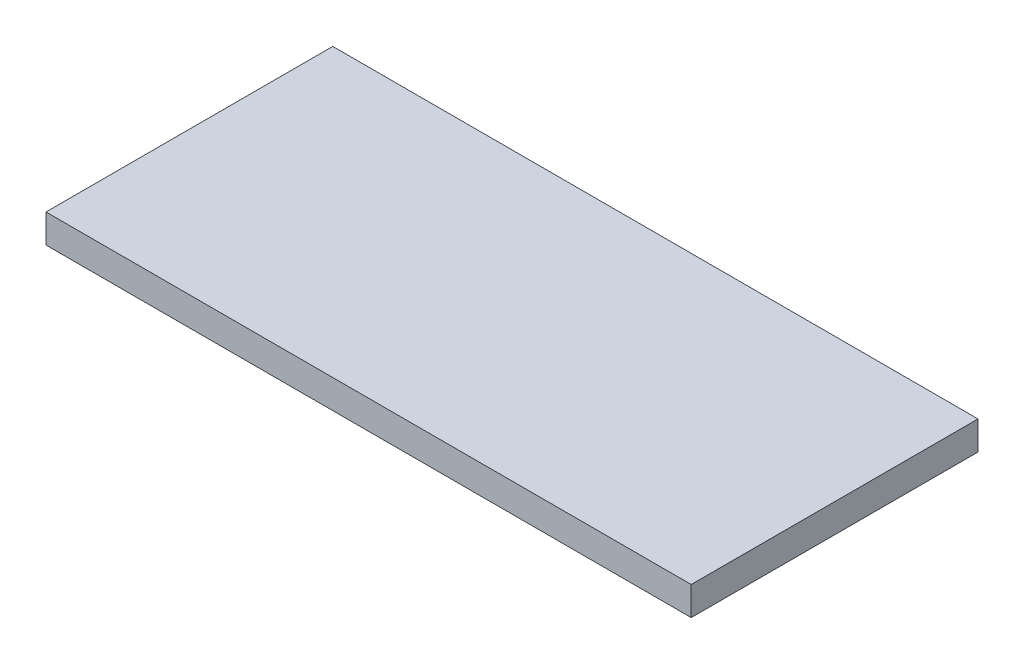
ISO-10303-21;
HEADER;
FILE_DESCRIPTION(('STEP AP214'),'2;1');
FILE_NAME('part.step','',(''),(''),'','','');
FILE_SCHEMA(('AUTOMOTIVE_DESIGN { 1 0 10303 214 1 1 1 1 }'));
ENDSEC;
DATA;
#1=APPLICATION_CONTEXT('core data for automotive mechanical design processes');
#2=APPLICATION_PROTOCOL_DEFINITION('international standard','automotive_design',2000,#1);
#3=PRODUCT_CONTEXT('',#1,'mechanical');
#4=PRODUCT('Part','Part','',(#3));
#5=PRODUCT_RELATED_PRODUCT_CATEGORY('part','',(#4));
#6=PRODUCT_DEFINITION_FORMATION('','',#4);
#7=PRODUCT_DEFINITION_CONTEXT('part definition',#1,'design');
#8=PRODUCT_DEFINITION('design','',#6,#7);
#9=PRODUCT_DEFINITION_SHAPE('','',#8);
#10=(LENGTH_UNIT() NAMED_UNIT(*) SI_UNIT(.MILLI.,.METRE.));
#11=(NAMED_UNIT(*) PLANE_ANGLE_UNIT() SI_UNIT($,.RADIAN.));
#12=(NAMED_UNIT(*) SI_UNIT($,.STERADIAN.) SOLID_ANGLE_UNIT());
#13=UNCERTAINTY_MEASURE_WITH_UNIT(LENGTH_MEASURE(1.E-05),#10,'distance_accuracy_value','');
#14=(GEOMETRIC_REPRESENTATION_CONTEXT(3) GLOBAL_UNCERTAINTY_ASSIGNED_CONTEXT((#13)) GLOBAL_UNIT_ASSIGNED_CONTEXT((#10,
#11,#12)) REPRESENTATION_CONTEXT('',''));
#15=CARTESIAN_POINT('',(0.,0.,0.));
#16=DIRECTION('',(0.,0.,1.));
#17=DIRECTION('',(1.,0.,0.));
#18=AXIS2_PLACEMENT_3D('',#15,#16,#17);
#19=CARTESIAN_POINT('',(-90.,8.,-40.));
#20=DIRECTION('',(1.,0.,0.));
#21=DIRECTION('',(0.,0.,-1.));
#22=AXIS2_PLACEMENT_3D('',#19,#20,#21);
#23=PLANE('',#22);
#24=DIRECTION('',(0.,0.,1.));
#25=VECTOR('',#24,1.);
#26=CARTESIAN_POINT('',(-90.,0.,-40.));
#27=LINE('',#26,#25);
#28=CARTESIAN_POINT('',(-90.,0.,-40.));
#29=VERTEX_POINT('',#28);
#30=CARTESIAN_POINT('',(-90.,0.,40.));
#31=VERTEX_POINT('',#30);
#32=EDGE_CURVE('E100',#29,#31,#27,.T.);
#33=ORIENTED_EDGE('',*,*,#32,.T.);
#34=DIRECTION('',(0.,-1.,0.));
#35=VECTOR('',#34,1.);
#36=CARTESIAN_POINT('',(-90.,8.,40.));
#37=LINE('',#36,#35);
#38=CARTESIAN_POINT('',(-90.,8.,40.));
#39=VERTEX_POINT('',#38);
#40=EDGE_CURVE('E11',#39,#31,#37,.T.);
#41=ORIENTED_EDGE('',*,*,#40,.F.);
#42=DIRECTION('',(0.,0.,1.));
#43=VECTOR('',#42,1.);
#44=CARTESIAN_POINT('',(-90.,8.,-40.));
#45=LINE('',#44,#43);
#46=CARTESIAN_POINT('',(-90.,8.,-40.));
#47=VERTEX_POINT('',#46);
#48=EDGE_CURVE('E88',#47,#39,#45,.T.);
#49=ORIENTED_EDGE('',*,*,#48,.F.);
#50=DIRECTION('',(0.,-1.,0.));
#51=VECTOR('',#50,1.);
#52=CARTESIAN_POINT('',(-90.,8.,-40.));
#53=LINE('',#52,#51);
#54=EDGE_CURVE('E96',#47,#29,#53,.T.);
#55=ORIENTED_EDGE('',*,*,#54,.T.);
#56=EDGE_LOOP('',(#33,#41,#49,#55));
#57=FACE_BOUND('',#56,.T.);
#58=ADVANCED_FACE('F37',(#57),#23,.F.);
#59=CARTESIAN_POINT('',(-90.,8.,40.));
#60=DIRECTION('',(0.,0.,-1.));
#61=DIRECTION('',(-1.,0.,0.));
#62=AXIS2_PLACEMENT_3D('',#59,#60,#61);
#63=PLANE('',#62);
#64=DIRECTION('',(1.,0.,0.));
#65=VECTOR('',#64,1.);
#66=CARTESIAN_POINT('',(-90.,0.,40.));
#67=LINE('',#66,#65);
#68=CARTESIAN_POINT('',(90.,0.,40.));
#69=VERTEX_POINT('',#68);
#70=EDGE_CURVE('E92',#31,#69,#67,.T.);
#71=ORIENTED_EDGE('',*,*,#70,.T.);
#72=DIRECTION('',(0.,-1.,0.));
#73=VECTOR('',#72,1.);
#74=CARTESIAN_POINT('',(90.,8.,40.));
#75=LINE('',#74,#73);
#76=CARTESIAN_POINT('',(90.,8.,40.));
#77=VERTEX_POINT('',#76);
#78=EDGE_CURVE('E45',#77,#69,#75,.T.);
#79=ORIENTED_EDGE('',*,*,#78,.F.);
#80=DIRECTION('',(1.,0.,0.));
#81=VECTOR('',#80,1.);
#82=CARTESIAN_POINT('',(-90.,8.,40.));
#83=LINE('',#82,#81);
#84=EDGE_CURVE('E83',#39,#77,#83,.T.);
#85=ORIENTED_EDGE('',*,*,#84,.F.);
#86=ORIENTED_EDGE('',*,*,#40,.T.);
#87=EDGE_LOOP('',(#71,#79,#85,#86));
#88=FACE_BOUND('',#87,.T.);
#89=ADVANCED_FACE('F91',(#88),#63,.F.);
#90=CARTESIAN_POINT('',(90.,8.,-40.));
#91=DIRECTION('',(-1.,0.,0.));
#92=DIRECTION('',(0.,0.,1.));
#93=AXIS2_PLACEMENT_3D('',#90,#91,#92);
#94=PLANE('',#93);
#95=DIRECTION('',(0.,0.,-1.));
#96=VECTOR('',#95,1.);
#97=CARTESIAN_POINT('',(90.,0.,-40.));
#98=LINE('',#97,#96);
#99=CARTESIAN_POINT('',(90.,0.,-40.));
#100=VERTEX_POINT('',#99);
#101=EDGE_CURVE('E70',#69,#100,#98,.T.);
#102=ORIENTED_EDGE('',*,*,#101,.T.);
#103=DIRECTION('',(0.,-1.,0.));
#104=VECTOR('',#103,1.);
#105=CARTESIAN_POINT('',(90.,8.,-40.));
#106=LINE('',#105,#104);
#107=CARTESIAN_POINT('',(90.,8.,-40.));
#108=VERTEX_POINT('',#107);
#109=EDGE_CURVE('E93',#108,#100,#106,.T.);
#110=ORIENTED_EDGE('',*,*,#109,.F.);
#111=DIRECTION('',(0.,0.,-1.));
#112=VECTOR('',#111,1.);
#113=CARTESIAN_POINT('',(90.,8.,-40.));
#114=LINE('',#113,#112);
#115=EDGE_CURVE('E86',#77,#108,#114,.T.);
#116=ORIENTED_EDGE('',*,*,#115,.F.);
#117=ORIENTED_EDGE('',*,*,#78,.T.);
#118=EDGE_LOOP('',(#102,#110,#116,#117));
#119=FACE_BOUND('',#118,.T.);
#120=ADVANCED_FACE('F94',(#119),#94,.F.);
#121=CARTESIAN_POINT('',(-90.,8.,-40.));
#122=DIRECTION('',(0.,0.,1.));
#123=DIRECTION('',(1.,0.,0.));
#124=AXIS2_PLACEMENT_3D('',#121,#122,#123);
#125=PLANE('',#124);
#126=DIRECTION('',(-1.,0.,0.));
#127=VECTOR('',#126,1.);
#128=CARTESIAN_POINT('',(-90.,0.,-40.));
#129=LINE('',#128,#127);
#130=EDGE_CURVE('E76',#100,#29,#129,.T.);
#131=ORIENTED_EDGE('',*,*,#130,.T.);
#132=ORIENTED_EDGE('',*,*,#54,.F.);
#133=DIRECTION('',(-1.,0.,0.));
#134=VECTOR('',#133,1.);
#135=CARTESIAN_POINT('',(-90.,8.,-40.));
#136=LINE('',#135,#134);
#137=EDGE_CURVE('E53',#108,#47,#136,.T.);
#138=ORIENTED_EDGE('',*,*,#137,.F.);
#139=ORIENTED_EDGE('',*,*,#109,.T.);
#140=EDGE_LOOP('',(#131,#132,#138,#139));
#141=FACE_BOUND('',#140,.T.);
#142=ADVANCED_FACE('F107',(#141),#125,.F.);
#143=CARTESIAN_POINT('',(0.,8.,0.));
#144=DIRECTION('',(0.,1.,0.));
#145=DIRECTION('',(0.,0.,1.));
#146=AXIS2_PLACEMENT_3D('',#143,#144,#145);
#147=PLANE('',#146);
#148=ORIENTED_EDGE('',*,*,#48,.T.);
#149=ORIENTED_EDGE('',*,*,#84,.T.);
#150=ORIENTED_EDGE('',*,*,#115,.T.);
#151=ORIENTED_EDGE('',*,*,#137,.T.);
#152=EDGE_LOOP('',(#148,#149,#150,#151));
#153=FACE_BOUND('',#152,.T.);
#154=ADVANCED_FACE('F84',(#153),#147,.T.);
#155=CARTESIAN_POINT('',(0.,0.,0.));
#156=DIRECTION('',(0.,1.,0.));
#157=DIRECTION('',(0.,0.,1.));
#158=AXIS2_PLACEMENT_3D('',#155,#156,#157);
#159=PLANE('',#158);
#160=ORIENTED_EDGE('',*,*,#32,.F.);
#161=ORIENTED_EDGE('',*,*,#130,.F.);
#162=ORIENTED_EDGE('',*,*,#101,.F.);
#163=ORIENTED_EDGE('',*,*,#70,.F.);
#164=EDGE_LOOP('',(#160,#161,#162,#163));
#165=FACE_BOUND('',#164,.T.);
#166=ADVANCED_FACE('F110',(#165),#159,.F.);
#167=CLOSED_SHELL('',(#58,#89,#120,#142,#154,#166));
#168=MANIFOLD_SOLID_BREP('B2',#167);
#169=ADVANCED_BREP_SHAPE_REPRESENTATION('',(#18,#168),#14);
#170=SHAPE_DEFINITION_REPRESENTATION(#9,#169);
ENDSEC;
END-ISO-10303-21;
